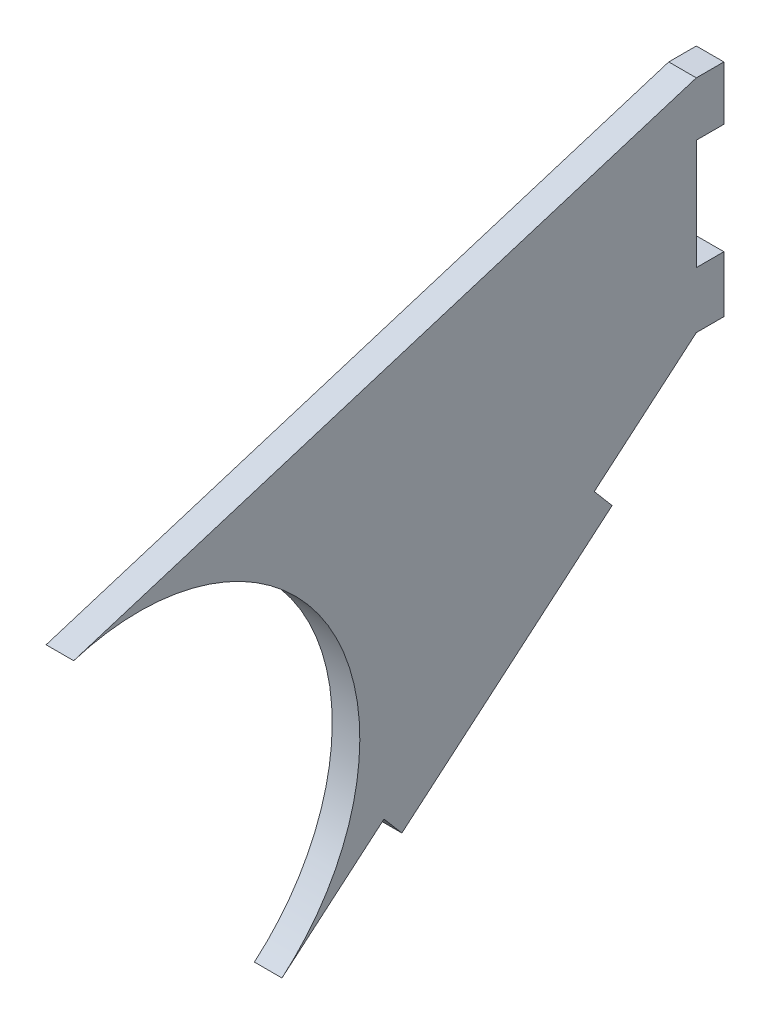
ISO-10303-21;
HEADER;
FILE_DESCRIPTION(('STEP AP214'),'2;1');
FILE_NAME('part.step','',(''),(''),'','','');
FILE_SCHEMA(('AUTOMOTIVE_DESIGN { 1 0 10303 214 1 1 1 1 }'));
ENDSEC;
DATA;
#1=APPLICATION_CONTEXT('core data for automotive mechanical design processes');
#2=APPLICATION_PROTOCOL_DEFINITION('international standard','automotive_design',2000,#1);
#3=PRODUCT_CONTEXT('',#1,'mechanical');
#4=PRODUCT('Part','Part','',(#3));
#5=PRODUCT_RELATED_PRODUCT_CATEGORY('part','',(#4));
#6=PRODUCT_DEFINITION_FORMATION('','',#4);
#7=PRODUCT_DEFINITION_CONTEXT('part definition',#1,'design');
#8=PRODUCT_DEFINITION('design','',#6,#7);
#9=PRODUCT_DEFINITION_SHAPE('','',#8);
#10=(LENGTH_UNIT() NAMED_UNIT(*) SI_UNIT(.MILLI.,.METRE.));
#11=(NAMED_UNIT(*) PLANE_ANGLE_UNIT() SI_UNIT($,.RADIAN.));
#12=(NAMED_UNIT(*) SI_UNIT($,.STERADIAN.) SOLID_ANGLE_UNIT());
#13=UNCERTAINTY_MEASURE_WITH_UNIT(LENGTH_MEASURE(1.E-05),#10,'distance_accuracy_value','');
#14=(GEOMETRIC_REPRESENTATION_CONTEXT(3) GLOBAL_UNCERTAINTY_ASSIGNED_CONTEXT((#13)) GLOBAL_UNIT_ASSIGNED_CONTEXT((#10,
#11,#12)) REPRESENTATION_CONTEXT('',''));
#15=CARTESIAN_POINT('',(0.,0.,0.));
#16=DIRECTION('',(0.,0.,1.));
#17=DIRECTION('',(1.,0.,0.));
#18=AXIS2_PLACEMENT_3D('',#15,#16,#17);
#19=CARTESIAN_POINT('',(1.5875,-16.9799,32.0675));
#20=DIRECTION('',(-1.,0.,0.));
#21=DIRECTION('',(0.,0.,1.));
#22=AXIS2_PLACEMENT_3D('',#19,#20,#21);
#23=CYLINDRICAL_SURFACE('',#22,12.7);
#24=CARTESIAN_POINT('',(0.,-16.9799,32.0675));
#25=DIRECTION('',(1.,0.,0.));
#26=DIRECTION('',(0.,0.,-1.));
#27=AXIS2_PLACEMENT_3D('',#24,#25,#26);
#28=CIRCLE('',#27,12.7);
#29=CARTESIAN_POINT('',(0.,-26.66159372801,23.848326893354));
#30=VERTEX_POINT('',#29);
#31=CARTESIAN_POINT('',(0.,-4.85198279979384,35.8362696115502));
#32=VERTEX_POINT('',#31);
#33=EDGE_CURVE('E326',#30,#32,#28,.T.);
#34=ORIENTED_EDGE('',*,*,#33,.F.);
#35=DIRECTION('',(-1.,0.,0.));
#36=VECTOR('',#35,1.);
#37=CARTESIAN_POINT('',(1.5875,-26.66159372801,23.848326893354));
#38=LINE('',#37,#36);
#39=CARTESIAN_POINT('',(1.5875,-26.66159372801,23.848326893354));
#40=VERTEX_POINT('',#39);
#41=EDGE_CURVE('E12',#40,#30,#38,.T.);
#42=ORIENTED_EDGE('',*,*,#41,.F.);
#43=CARTESIAN_POINT('',(1.5875,-16.9799,32.0675));
#44=DIRECTION('',(1.,0.,0.));
#45=DIRECTION('',(0.,0.,-1.));
#46=AXIS2_PLACEMENT_3D('',#43,#44,#45);
#47=CIRCLE('',#46,12.7);
#48=CARTESIAN_POINT('',(1.5875,-4.85198279979384,35.8362696115502));
#49=VERTEX_POINT('',#48);
#50=EDGE_CURVE('E260',#40,#49,#47,.T.);
#51=ORIENTED_EDGE('',*,*,#50,.T.);
#52=DIRECTION('',(-1.,0.,0.));
#53=VECTOR('',#52,1.);
#54=CARTESIAN_POINT('',(1.5875,-4.85198279979384,35.8362696115502));
#55=LINE('',#54,#53);
#56=EDGE_CURVE('E133',#49,#32,#55,.T.);
#57=ORIENTED_EDGE('',*,*,#56,.T.);
#58=EDGE_LOOP('',(#34,#42,#51,#57));
#59=FACE_BOUND('',#58,.T.);
#60=ADVANCED_FACE('F48',(#59),#23,.F.);
#61=CARTESIAN_POINT('',(1.5875,-3.72860506070824,-3.16536045254307));
#62=DIRECTION('',(0.,-0.762338088819685,-0.647178984775271));
#63=DIRECTION('',(0.,0.647178984775271,-0.762338088819685));
#64=AXIS2_PLACEMENT_3D('',#61,#62,#63);
#65=PLANE('',#64);
#66=DIRECTION('',(0.,-0.647178984775271,0.762338088819685));
#67=VECTOR('',#66,1.);
#68=CARTESIAN_POINT('',(0.,-3.72860506070824,-3.16536045254307));
#69=LINE('',#68,#67);
#70=CARTESIAN_POINT('',(0.,-21.6756824888436,17.9752220266833));
#71=VERTEX_POINT('',#70);
#72=EDGE_CURVE('E322',#71,#30,#69,.T.);
#73=ORIENTED_EDGE('',*,*,#72,.F.);
#74=DIRECTION('',(-1.,0.,0.));
#75=VECTOR('',#74,1.);
#76=CARTESIAN_POINT('',(1.5875,-21.6756824888436,17.9752220266833));
#77=LINE('',#76,#75);
#78=CARTESIAN_POINT('',(1.5875,-21.6756824888436,17.9752220266833));
#79=VERTEX_POINT('',#78);
#80=EDGE_CURVE('E57',#79,#71,#77,.T.);
#81=ORIENTED_EDGE('',*,*,#80,.F.);
#82=DIRECTION('',(0.,-0.647178984775271,0.762338088819685));
#83=VECTOR('',#82,1.);
#84=CARTESIAN_POINT('',(1.5875,-3.72860506070824,-3.16536045254307));
#85=LINE('',#84,#83);
#86=EDGE_CURVE('E255',#79,#40,#85,.T.);
#87=ORIENTED_EDGE('',*,*,#86,.T.);
#88=ORIENTED_EDGE('',*,*,#41,.T.);
#89=EDGE_LOOP('',(#73,#81,#87,#88));
#90=FACE_BOUND('',#89,.T.);
#91=ADVANCED_FACE('F323',(#90),#65,.T.);
#92=CARTESIAN_POINT('',(1.5875,-17.9470774281353,21.1405824792263));
#93=DIRECTION('',(0.,-0.64717898477527,0.762338088819685));
#94=DIRECTION('',(0.,-0.762338088819685,-0.64717898477527));
#95=AXIS2_PLACEMENT_3D('',#92,#93,#94);
#96=PLANE('',#95);
#97=DIRECTION('',(0.,0.762338088819685,0.64717898477527));
#98=VECTOR('',#97,1.);
#99=CARTESIAN_POINT('',(0.,-17.9470774281353,21.1405824792263));
#100=LINE('',#99,#98);
#101=CARTESIAN_POINT('',(0.,-22.8858942048448,16.9478253883525));
#102=VERTEX_POINT('',#101);
#103=EDGE_CURVE('E317',#102,#71,#100,.T.);
#104=ORIENTED_EDGE('',*,*,#103,.F.);
#105=DIRECTION('',(-1.,0.,0.));
#106=VECTOR('',#105,1.);
#107=CARTESIAN_POINT('',(1.5875,-22.8858942048448,16.9478253883525));
#108=LINE('',#107,#106);
#109=CARTESIAN_POINT('',(1.5875,-22.8858942048448,16.9478253883525));
#110=VERTEX_POINT('',#109);
#111=EDGE_CURVE('E307',#110,#102,#108,.T.);
#112=ORIENTED_EDGE('',*,*,#111,.F.);
#113=DIRECTION('',(0.,0.762338088819685,0.64717898477527));
#114=VECTOR('',#113,1.);
#115=CARTESIAN_POINT('',(1.5875,-17.9470774281353,21.1405824792263));
#116=LINE('',#115,#114);
#117=EDGE_CURVE('E251',#110,#79,#116,.T.);
#118=ORIENTED_EDGE('',*,*,#117,.T.);
#119=ORIENTED_EDGE('',*,*,#80,.T.);
#120=EDGE_LOOP('',(#104,#112,#118,#119));
#121=FACE_BOUND('',#120,.T.);
#122=ADVANCED_FACE('F315',(#121),#96,.T.);
#123=CARTESIAN_POINT('',(1.5875,-4.93881677670949,-4.19275709087382));
#124=DIRECTION('',(0.,0.762338088819684,0.647178984775271));
#125=DIRECTION('',(0.,-0.647178984775271,0.762338088819685));
#126=AXIS2_PLACEMENT_3D('',#123,#124,#125);
#127=PLANE('',#126);
#128=DIRECTION('',(0.,0.647178984775271,-0.762338088819685));
#129=VECTOR('',#128,1.);
#130=CARTESIAN_POINT('',(0.,-4.93881677670949,-4.19275709087382));
#131=LINE('',#130,#129);
#132=CARTESIAN_POINT('',(0.,-12.6119278215374,4.84570822834003));
#133=VERTEX_POINT('',#132);
#134=EDGE_CURVE('E333',#102,#133,#131,.T.);
#135=ORIENTED_EDGE('',*,*,#134,.T.);
#136=DIRECTION('',(-1.,0.,0.));
#137=VECTOR('',#136,1.);
#138=CARTESIAN_POINT('',(1.5875,-12.6119278215374,4.84570822834003));
#139=LINE('',#138,#137);
#140=CARTESIAN_POINT('',(1.5875,-12.6119278215374,4.84570822834003));
#141=VERTEX_POINT('',#140);
#142=EDGE_CURVE('E304',#141,#133,#139,.T.);
#143=ORIENTED_EDGE('',*,*,#142,.F.);
#144=DIRECTION('',(0.,0.647178984775271,-0.762338088819685));
#145=VECTOR('',#144,1.);
#146=CARTESIAN_POINT('',(1.5875,-4.93881677670949,-4.19275709087382));
#147=LINE('',#146,#145);
#148=EDGE_CURVE('E244',#110,#141,#147,.T.);
#149=ORIENTED_EDGE('',*,*,#148,.F.);
#150=ORIENTED_EDGE('',*,*,#111,.T.);
#151=EDGE_LOOP('',(#135,#143,#149,#150));
#152=FACE_BOUND('',#151,.T.);
#153=ADVANCED_FACE('F457',(#152),#127,.F.);
#154=CARTESIAN_POINT('',(1.5875,-7.6731110448279,9.03846531921384));
#155=DIRECTION('',(0.,0.647178984775271,-0.762338088819685));
#156=DIRECTION('',(0.,0.762338088819685,0.647178984775271));
#157=AXIS2_PLACEMENT_3D('',#154,#155,#156);
#158=PLANE('',#157);
#159=DIRECTION('',(0.,-0.762338088819685,-0.647178984775271));
#160=VECTOR('',#159,1.);
#161=CARTESIAN_POINT('',(0.,-7.6731110448279,9.03846531921384));
#162=LINE('',#161,#160);
#163=CARTESIAN_POINT('',(0.,-11.4017161055361,5.87310486667077));
#164=VERTEX_POINT('',#163);
#165=EDGE_CURVE('E339',#164,#133,#162,.T.);
#166=ORIENTED_EDGE('',*,*,#165,.F.);
#167=DIRECTION('',(-1.,0.,0.));
#168=VECTOR('',#167,1.);
#169=CARTESIAN_POINT('',(1.5875,-11.4017161055361,5.87310486667077));
#170=LINE('',#169,#168);
#171=CARTESIAN_POINT('',(1.5875,-11.4017161055361,5.87310486667077));
#172=VERTEX_POINT('',#171);
#173=EDGE_CURVE('E301',#172,#164,#170,.T.);
#174=ORIENTED_EDGE('',*,*,#173,.F.);
#175=DIRECTION('',(0.,-0.762338088819685,-0.647178984775271));
#176=VECTOR('',#175,1.);
#177=CARTESIAN_POINT('',(1.5875,-7.6731110448279,9.03846531921384));
#178=LINE('',#177,#176);
#179=EDGE_CURVE('E239',#172,#141,#178,.T.);
#180=ORIENTED_EDGE('',*,*,#179,.T.);
#181=ORIENTED_EDGE('',*,*,#142,.T.);
#182=EDGE_LOOP('',(#166,#174,#180,#181));
#183=FACE_BOUND('',#182,.T.);
#184=ADVANCED_FACE('F453',(#183),#158,.T.);
#185=CARTESIAN_POINT('',(0.,-6.41580486636974,0.));
#186=VERTEX_POINT('',#185);
#187=EDGE_CURVE('E328',#186,#164,#69,.T.);
#188=ORIENTED_EDGE('',*,*,#187,.F.);
#189=DIRECTION('',(-1.,0.,0.));
#190=VECTOR('',#189,1.);
#191=CARTESIAN_POINT('',(1.5875,-6.41580486636974,0.));
#192=LINE('',#191,#190);
#193=CARTESIAN_POINT('',(1.5875,-6.41580486636974,0.));
#194=VERTEX_POINT('',#193);
#195=EDGE_CURVE('E298',#194,#186,#192,.T.);
#196=ORIENTED_EDGE('',*,*,#195,.F.);
#197=EDGE_CURVE('E238',#194,#172,#85,.T.);
#198=ORIENTED_EDGE('',*,*,#197,.T.);
#199=ORIENTED_EDGE('',*,*,#173,.T.);
#200=EDGE_LOOP('',(#188,#196,#198,#199));
#201=FACE_BOUND('',#200,.T.);
#202=ADVANCED_FACE('F448',(#201),#65,.T.);
#203=CARTESIAN_POINT('',(1.5875,-6.41580486636974,0.));
#204=DIRECTION('',(0.,1.,0.));
#205=DIRECTION('',(0.,0.,1.));
#206=AXIS2_PLACEMENT_3D('',#203,#204,#205);
#207=PLANE('',#206);
#208=DIRECTION('',(0.,0.,-1.));
#209=VECTOR('',#208,1.);
#210=CARTESIAN_POINT('',(0.,-6.41580486636974,0.));
#211=LINE('',#210,#209);
#212=CARTESIAN_POINT('',(0.,-6.41580486636974,-1.5875));
#213=VERTEX_POINT('',#212);
#214=EDGE_CURVE('E344',#186,#213,#211,.T.);
#215=ORIENTED_EDGE('',*,*,#214,.T.);
#216=DIRECTION('',(-1.,0.,0.));
#217=VECTOR('',#216,1.);
#218=CARTESIAN_POINT('',(1.5875,-6.41580486636974,-1.5875));
#219=LINE('',#218,#217);
#220=CARTESIAN_POINT('',(1.5875,-6.41580486636974,-1.5875));
#221=VERTEX_POINT('',#220);
#222=EDGE_CURVE('E294',#221,#213,#219,.T.);
#223=ORIENTED_EDGE('',*,*,#222,.F.);
#224=DIRECTION('',(0.,0.,-1.));
#225=VECTOR('',#224,1.);
#226=CARTESIAN_POINT('',(1.5875,-6.41580486636974,0.));
#227=LINE('',#226,#225);
#228=EDGE_CURVE('E234',#194,#221,#227,.T.);
#229=ORIENTED_EDGE('',*,*,#228,.F.);
#230=ORIENTED_EDGE('',*,*,#195,.T.);
#231=EDGE_LOOP('',(#215,#223,#229,#230));
#232=FACE_BOUND('',#231,.T.);
#233=ADVANCED_FACE('F462',(#232),#207,.F.);
#234=CARTESIAN_POINT('',(1.5875,0.,-1.5875));
#235=DIRECTION('',(0.,0.,1.));
#236=DIRECTION('',(1.,0.,0.));
#237=AXIS2_PLACEMENT_3D('',#234,#235,#236);
#238=PLANE('',#237);
#239=DIRECTION('',(0.,1.,0.));
#240=VECTOR('',#239,1.);
#241=CARTESIAN_POINT('',(0.,0.,-1.5875));
#242=LINE('',#241,#240);
#243=CARTESIAN_POINT('',(0.,-3.175,-1.5875));
#244=VERTEX_POINT('',#243);
#245=EDGE_CURVE('E347',#213,#244,#242,.T.);
#246=ORIENTED_EDGE('',*,*,#245,.T.);
#247=DIRECTION('',(-1.,0.,0.));
#248=VECTOR('',#247,1.);
#249=CARTESIAN_POINT('',(1.5875,-3.175,-1.5875));
#250=LINE('',#249,#248);
#251=CARTESIAN_POINT('',(1.5875,-3.175,-1.5875));
#252=VERTEX_POINT('',#251);
#253=EDGE_CURVE('E290',#252,#244,#250,.T.);
#254=ORIENTED_EDGE('',*,*,#253,.F.);
#255=DIRECTION('',(0.,1.,0.));
#256=VECTOR('',#255,1.);
#257=CARTESIAN_POINT('',(1.5875,0.,-1.5875));
#258=LINE('',#257,#256);
#259=EDGE_CURVE('E226',#221,#252,#258,.T.);
#260=ORIENTED_EDGE('',*,*,#259,.F.);
#261=ORIENTED_EDGE('',*,*,#222,.T.);
#262=EDGE_LOOP('',(#246,#254,#260,#261));
#263=FACE_BOUND('',#262,.T.);
#264=ADVANCED_FACE('F464',(#263),#238,.F.);
#265=CARTESIAN_POINT('',(1.5875,-3.175,0.));
#266=DIRECTION('',(0.,-1.,0.));
#267=DIRECTION('',(0.,0.,-1.));
#268=AXIS2_PLACEMENT_3D('',#265,#266,#267);
#269=PLANE('',#268);
#270=DIRECTION('',(0.,0.,1.));
#271=VECTOR('',#270,1.);
#272=CARTESIAN_POINT('',(0.,-3.175,0.));
#273=LINE('',#272,#271);
#274=CARTESIAN_POINT('',(0.,-3.175,0.));
#275=VERTEX_POINT('',#274);
#276=EDGE_CURVE('E350',#244,#275,#273,.T.);
#277=ORIENTED_EDGE('',*,*,#276,.T.);
#278=DIRECTION('',(-1.,0.,0.));
#279=VECTOR('',#278,1.);
#280=CARTESIAN_POINT('',(1.5875,-3.175,0.));
#281=LINE('',#280,#279);
#282=CARTESIAN_POINT('',(1.5875,-3.175,0.));
#283=VERTEX_POINT('',#282);
#284=EDGE_CURVE('E286',#283,#275,#281,.T.);
#285=ORIENTED_EDGE('',*,*,#284,.F.);
#286=DIRECTION('',(0.,0.,1.));
#287=VECTOR('',#286,1.);
#288=CARTESIAN_POINT('',(1.5875,-3.175,0.));
#289=LINE('',#288,#287);
#290=EDGE_CURVE('E222',#252,#283,#289,.T.);
#291=ORIENTED_EDGE('',*,*,#290,.F.);
#292=ORIENTED_EDGE('',*,*,#253,.T.);
#293=EDGE_LOOP('',(#277,#285,#291,#292));
#294=FACE_BOUND('',#293,.T.);
#295=ADVANCED_FACE('F469',(#294),#269,.F.);
#296=CARTESIAN_POINT('',(1.5875,0.,0.));
#297=DIRECTION('',(0.,0.,1.));
#298=DIRECTION('',(1.,0.,0.));
#299=AXIS2_PLACEMENT_3D('',#296,#297,#298);
#300=PLANE('',#299);
#301=DIRECTION('',(0.,1.,0.));
#302=VECTOR('',#301,1.);
#303=CARTESIAN_POINT('',(0.,0.,0.));
#304=LINE('',#303,#302);
#305=CARTESIAN_POINT('',(0.,3.175,0.));
#306=VERTEX_POINT('',#305);
#307=EDGE_CURVE('E353',#275,#306,#304,.T.);
#308=ORIENTED_EDGE('',*,*,#307,.T.);
#309=DIRECTION('',(-1.,0.,0.));
#310=VECTOR('',#309,1.);
#311=CARTESIAN_POINT('',(1.5875,3.175,0.));
#312=LINE('',#311,#310);
#313=CARTESIAN_POINT('',(1.5875,3.175,0.));
#314=VERTEX_POINT('',#313);
#315=EDGE_CURVE('E283',#314,#306,#312,.T.);
#316=ORIENTED_EDGE('',*,*,#315,.F.);
#317=DIRECTION('',(0.,1.,0.));
#318=VECTOR('',#317,1.);
#319=CARTESIAN_POINT('',(1.5875,0.,0.));
#320=LINE('',#319,#318);
#321=EDGE_CURVE('E218',#283,#314,#320,.T.);
#322=ORIENTED_EDGE('',*,*,#321,.F.);
#323=ORIENTED_EDGE('',*,*,#284,.T.);
#324=EDGE_LOOP('',(#308,#316,#322,#323));
#325=FACE_BOUND('',#324,.T.);
#326=ADVANCED_FACE('F473',(#325),#300,.F.);
#327=CARTESIAN_POINT('',(1.5875,3.175,0.));
#328=DIRECTION('',(0.,-1.,0.));
#329=DIRECTION('',(0.,0.,-1.));
#330=AXIS2_PLACEMENT_3D('',#327,#328,#329);
#331=PLANE('',#330);
#332=DIRECTION('',(0.,0.,1.));
#333=VECTOR('',#332,1.);
#334=CARTESIAN_POINT('',(0.,3.175,0.));
#335=LINE('',#334,#333);
#336=CARTESIAN_POINT('',(0.,3.175,-1.5875));
#337=VERTEX_POINT('',#336);
#338=EDGE_CURVE('E357',#337,#306,#335,.T.);
#339=ORIENTED_EDGE('',*,*,#338,.F.);
#340=DIRECTION('',(-1.,0.,0.));
#341=VECTOR('',#340,1.);
#342=CARTESIAN_POINT('',(1.5875,3.175,-1.5875));
#343=LINE('',#342,#341);
#344=CARTESIAN_POINT('',(1.5875,3.175,-1.5875));
#345=VERTEX_POINT('',#344);
#346=EDGE_CURVE('E191',#345,#337,#343,.T.);
#347=ORIENTED_EDGE('',*,*,#346,.F.);
#348=DIRECTION('',(0.,0.,1.));
#349=VECTOR('',#348,1.);
#350=CARTESIAN_POINT('',(1.5875,3.175,0.));
#351=LINE('',#350,#349);
#352=EDGE_CURVE('E197',#345,#314,#351,.T.);
#353=ORIENTED_EDGE('',*,*,#352,.T.);
#354=ORIENTED_EDGE('',*,*,#315,.T.);
#355=EDGE_LOOP('',(#339,#347,#353,#354));
#356=FACE_BOUND('',#355,.T.);
#357=ADVANCED_FACE('F475',(#356),#331,.T.);
#358=CARTESIAN_POINT('',(1.5875,0.,-1.5875));
#359=DIRECTION('',(0.,0.,-1.));
#360=DIRECTION('',(-1.,0.,0.));
#361=AXIS2_PLACEMENT_3D('',#358,#359,#360);
#362=PLANE('',#361);
#363=DIRECTION('',(0.,-1.,0.));
#364=VECTOR('',#363,1.);
#365=CARTESIAN_POINT('',(0.,0.,-1.5875));
#366=LINE('',#365,#364);
#367=CARTESIAN_POINT('',(0.,6.28419513363026,-1.5875));
#368=VERTEX_POINT('',#367);
#369=EDGE_CURVE('E185',#368,#337,#366,.T.);
#370=ORIENTED_EDGE('',*,*,#369,.F.);
#371=DIRECTION('',(-1.,0.,0.));
#372=VECTOR('',#371,1.);
#373=CARTESIAN_POINT('',(1.5875,6.28419513363026,-1.5875));
#374=LINE('',#373,#372);
#375=CARTESIAN_POINT('',(1.5875,6.28419513363026,-1.5875));
#376=VERTEX_POINT('',#375);
#377=EDGE_CURVE('E180',#376,#368,#374,.T.);
#378=ORIENTED_EDGE('',*,*,#377,.F.);
#379=DIRECTION('',(0.,-1.,0.));
#380=VECTOR('',#379,1.);
#381=CARTESIAN_POINT('',(1.5875,0.,-1.5875));
#382=LINE('',#381,#380);
#383=EDGE_CURVE('E183',#376,#345,#382,.T.);
#384=ORIENTED_EDGE('',*,*,#383,.T.);
#385=ORIENTED_EDGE('',*,*,#346,.T.);
#386=EDGE_LOOP('',(#370,#378,#384,#385));
#387=FACE_BOUND('',#386,.T.);
#388=ADVANCED_FACE('F182',(#387),#362,.T.);
#389=CARTESIAN_POINT('',(1.5875,6.28419513363026,0.));
#390=DIRECTION('',(0.,1.,0.));
#391=DIRECTION('',(0.,0.,1.));
#392=AXIS2_PLACEMENT_3D('',#389,#390,#391);
#393=PLANE('',#392);
#394=DIRECTION('',(0.,0.,-1.));
#395=VECTOR('',#394,1.);
#396=CARTESIAN_POINT('',(0.,6.28419513363026,0.));
#397=LINE('',#396,#395);
#398=CARTESIAN_POINT('',(0.,6.28419513363026,0.));
#399=VERTEX_POINT('',#398);
#400=EDGE_CURVE('E268',#399,#368,#397,.T.);
#401=ORIENTED_EDGE('',*,*,#400,.F.);
#402=DIRECTION('',(-1.,0.,0.));
#403=VECTOR('',#402,1.);
#404=CARTESIAN_POINT('',(1.5875,6.28419513363026,0.));
#405=LINE('',#404,#403);
#406=CARTESIAN_POINT('',(1.5875,6.28419513363026,0.));
#407=VERTEX_POINT('',#406);
#408=EDGE_CURVE('E126',#407,#399,#405,.T.);
#409=ORIENTED_EDGE('',*,*,#408,.F.);
#410=DIRECTION('',(0.,0.,-1.));
#411=VECTOR('',#410,1.);
#412=CARTESIAN_POINT('',(1.5875,6.28419513363026,0.));
#413=LINE('',#412,#411);
#414=EDGE_CURVE('E195',#407,#376,#413,.T.);
#415=ORIENTED_EDGE('',*,*,#414,.T.);
#416=ORIENTED_EDGE('',*,*,#377,.T.);
#417=EDGE_LOOP('',(#401,#409,#415,#416));
#418=FACE_BOUND('',#417,.T.);
#419=ADVANCED_FACE('F200',(#418),#393,.T.);
#420=CARTESIAN_POINT('',(1.5875,5.73079227393791,1.78085283858606));
#421=DIRECTION('',(0.,-0.954954110252451,-0.296753512720488));
#422=DIRECTION('',(0.,0.296753512720488,-0.954954110252451));
#423=AXIS2_PLACEMENT_3D('',#420,#421,#422);
#424=PLANE('',#423);
#425=DIRECTION('',(0.,-0.296753512720488,0.954954110252451));
#426=VECTOR('',#425,1.);
#427=CARTESIAN_POINT('',(0.,5.73079227393791,1.78085283858606));
#428=LINE('',#427,#426);
#429=EDGE_CURVE('E264',#399,#32,#428,.T.);
#430=ORIENTED_EDGE('',*,*,#429,.T.);
#431=ORIENTED_EDGE('',*,*,#56,.F.);
#432=DIRECTION('',(0.,-0.296753512720488,0.954954110252451));
#433=VECTOR('',#432,1.);
#434=CARTESIAN_POINT('',(1.5875,5.73079227393791,1.78085283858606));
#435=LINE('',#434,#433);
#436=EDGE_CURVE('E68',#407,#49,#435,.T.);
#437=ORIENTED_EDGE('',*,*,#436,.F.);
#438=ORIENTED_EDGE('',*,*,#408,.T.);
#439=EDGE_LOOP('',(#430,#431,#437,#438));
#440=FACE_BOUND('',#439,.T.);
#441=ADVANCED_FACE('F540',(#440),#424,.F.);
#442=CARTESIAN_POINT('',(1.5875,0.,0.));
#443=DIRECTION('',(1.,0.,0.));
#444=DIRECTION('',(0.,0.,-1.));
#445=AXIS2_PLACEMENT_3D('',#442,#443,#444);
#446=PLANE('',#445);
#447=ORIENTED_EDGE('',*,*,#50,.F.);
#448=ORIENTED_EDGE('',*,*,#86,.F.);
#449=ORIENTED_EDGE('',*,*,#117,.F.);
#450=ORIENTED_EDGE('',*,*,#148,.T.);
#451=ORIENTED_EDGE('',*,*,#179,.F.);
#452=ORIENTED_EDGE('',*,*,#197,.F.);
#453=ORIENTED_EDGE('',*,*,#228,.T.);
#454=ORIENTED_EDGE('',*,*,#259,.T.);
#455=ORIENTED_EDGE('',*,*,#290,.T.);
#456=ORIENTED_EDGE('',*,*,#321,.T.);
#457=ORIENTED_EDGE('',*,*,#352,.F.);
#458=ORIENTED_EDGE('',*,*,#383,.F.);
#459=ORIENTED_EDGE('',*,*,#414,.F.);
#460=ORIENTED_EDGE('',*,*,#436,.T.);
#461=EDGE_LOOP('',(#447,#448,#449,#450,#451,#452,#453,#454,#455,#456,#457,#458,#459,#460));
#462=FACE_BOUND('',#461,.T.);
#463=ADVANCED_FACE('F194',(#462),#446,.T.);
#464=CARTESIAN_POINT('',(0.,0.,0.));
#465=DIRECTION('',(1.,0.,0.));
#466=DIRECTION('',(0.,0.,-1.));
#467=AXIS2_PLACEMENT_3D('',#464,#465,#466);
#468=PLANE('',#467);
#469=ORIENTED_EDGE('',*,*,#33,.T.);
#470=ORIENTED_EDGE('',*,*,#429,.F.);
#471=ORIENTED_EDGE('',*,*,#400,.T.);
#472=ORIENTED_EDGE('',*,*,#369,.T.);
#473=ORIENTED_EDGE('',*,*,#338,.T.);
#474=ORIENTED_EDGE('',*,*,#307,.F.);
#475=ORIENTED_EDGE('',*,*,#276,.F.);
#476=ORIENTED_EDGE('',*,*,#245,.F.);
#477=ORIENTED_EDGE('',*,*,#214,.F.);
#478=ORIENTED_EDGE('',*,*,#187,.T.);
#479=ORIENTED_EDGE('',*,*,#165,.T.);
#480=ORIENTED_EDGE('',*,*,#134,.F.);
#481=ORIENTED_EDGE('',*,*,#103,.T.);
#482=ORIENTED_EDGE('',*,*,#72,.T.);
#483=EDGE_LOOP('',(#469,#470,#471,#472,#473,#474,#475,#476,#477,#478,#479,#480,#481,#482));
#484=FACE_BOUND('',#483,.T.);
#485=ADVANCED_FACE('F330',(#484),#468,.F.);
#486=CLOSED_SHELL('',(#60,#91,#122,#153,#184,#202,#233,#264,#295,#326,#357,#388,#419,#441,#463,#485));
#487=MANIFOLD_SOLID_BREP('B2',#486);
#488=ADVANCED_BREP_SHAPE_REPRESENTATION('',(#18,#487),#14);
#489=SHAPE_DEFINITION_REPRESENTATION(#9,#488);
ENDSEC;
END-ISO-10303-21;
